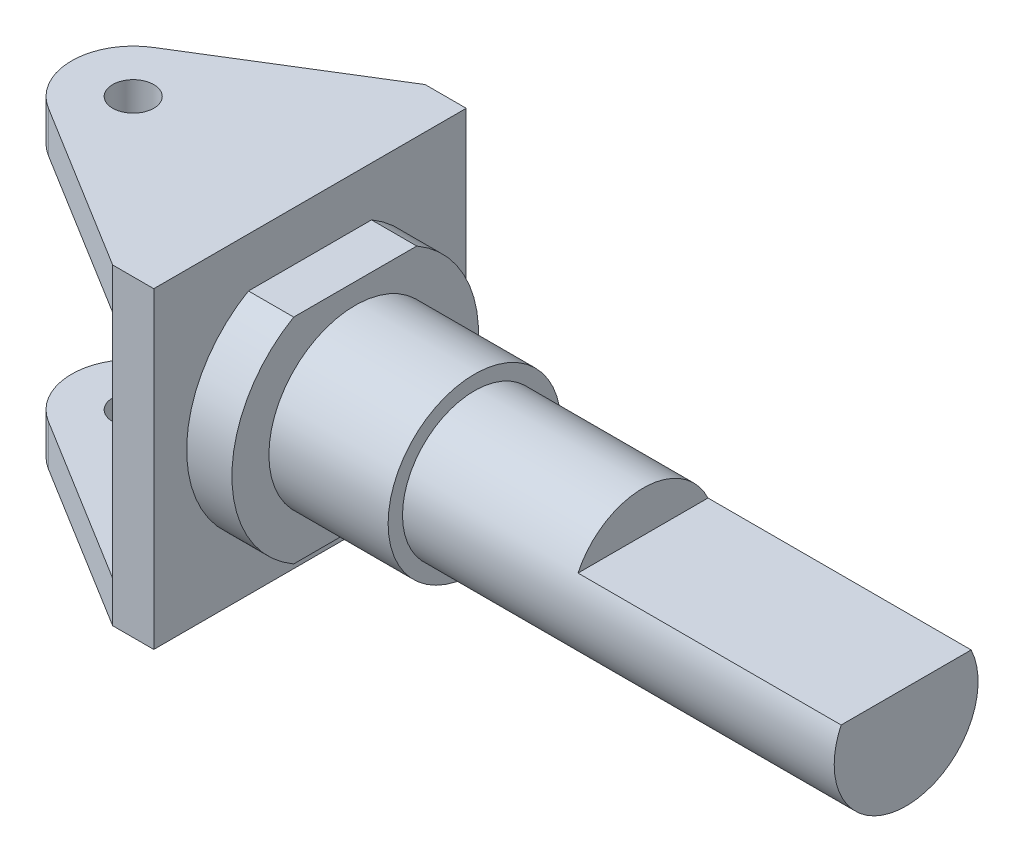
ISO-10303-21;
HEADER;
FILE_DESCRIPTION(('STEP AP214'),'2;1');
FILE_NAME('part.step','',(''),(''),'','','');
FILE_SCHEMA(('AUTOMOTIVE_DESIGN { 1 0 10303 214 1 1 1 1 }'));
ENDSEC;
DATA;
#1=APPLICATION_CONTEXT('core data for automotive mechanical design processes');
#2=APPLICATION_PROTOCOL_DEFINITION('international standard','automotive_design',2000,#1);
#3=PRODUCT_CONTEXT('',#1,'mechanical');
#4=PRODUCT('Part','Part','',(#3));
#5=PRODUCT_RELATED_PRODUCT_CATEGORY('part','',(#4));
#6=PRODUCT_DEFINITION_FORMATION('','',#4);
#7=PRODUCT_DEFINITION_CONTEXT('part definition',#1,'design');
#8=PRODUCT_DEFINITION('design','',#6,#7);
#9=PRODUCT_DEFINITION_SHAPE('','',#8);
#10=(LENGTH_UNIT() NAMED_UNIT(*) SI_UNIT(.MILLI.,.METRE.));
#11=(NAMED_UNIT(*) PLANE_ANGLE_UNIT() SI_UNIT($,.RADIAN.));
#12=(NAMED_UNIT(*) SI_UNIT($,.STERADIAN.) SOLID_ANGLE_UNIT());
#13=UNCERTAINTY_MEASURE_WITH_UNIT(LENGTH_MEASURE(1.E-05),#10,'distance_accuracy_value','');
#14=(GEOMETRIC_REPRESENTATION_CONTEXT(3) GLOBAL_UNCERTAINTY_ASSIGNED_CONTEXT((#13)) GLOBAL_UNIT_ASSIGNED_CONTEXT((#10,
#11,#12)) REPRESENTATION_CONTEXT('',''));
#15=CARTESIAN_POINT('',(0.,0.,0.));
#16=DIRECTION('',(0.,0.,1.));
#17=DIRECTION('',(1.,0.,0.));
#18=AXIS2_PLACEMENT_3D('',#15,#16,#17);
#19=CARTESIAN_POINT('',(-26.6804738151481,0.,0.));
#20=DIRECTION('',(-1.,0.,0.));
#21=DIRECTION('',(0.,0.,1.));
#22=AXIS2_PLACEMENT_3D('',#19,#20,#21);
#23=PLANE('',#22);
#24=DIRECTION('',(0.,-1.,0.));
#25=VECTOR('',#24,1.);
#26=CARTESIAN_POINT('',(-26.6804738151481,38.,-38.));
#27=LINE('',#26,#25);
#28=CARTESIAN_POINT('',(-26.6804738151481,28.,-38.));
#29=VERTEX_POINT('',#28);
#30=CARTESIAN_POINT('',(-26.6804738151481,-28.,-38.));
#31=VERTEX_POINT('',#30);
#32=EDGE_CURVE('E254',#29,#31,#27,.T.);
#33=ORIENTED_EDGE('',*,*,#32,.T.);
#34=DIRECTION('',(0.,0.,1.));
#35=VECTOR('',#34,1.);
#36=CARTESIAN_POINT('',(-26.6804738151481,-28.,0.));
#37=LINE('',#36,#35);
#38=CARTESIAN_POINT('',(-26.6804738151481,-28.,38.));
#39=VERTEX_POINT('',#38);
#40=EDGE_CURVE('E55',#31,#39,#37,.T.);
#41=ORIENTED_EDGE('',*,*,#40,.T.);
#42=DIRECTION('',(0.,1.,0.));
#43=VECTOR('',#42,1.);
#44=CARTESIAN_POINT('',(-26.6804738151481,38.,38.));
#45=LINE('',#44,#43);
#46=CARTESIAN_POINT('',(-26.6804738151481,28.,38.));
#47=VERTEX_POINT('',#46);
#48=EDGE_CURVE('E255',#39,#47,#45,.T.);
#49=ORIENTED_EDGE('',*,*,#48,.T.);
#50=DIRECTION('',(0.,0.,1.));
#51=VECTOR('',#50,1.);
#52=CARTESIAN_POINT('',(-26.6804738151481,28.,0.));
#53=LINE('',#52,#51);
#54=EDGE_CURVE('E217',#29,#47,#53,.T.);
#55=ORIENTED_EDGE('',*,*,#54,.F.);
#56=EDGE_LOOP('',(#33,#41,#49,#55));
#57=FACE_BOUND('',#56,.T.);
#58=ADVANCED_FACE('F39',(#57),#23,.T.);
#59=CARTESIAN_POINT('',(-16.6804738151481,0.,0.));
#60=DIRECTION('',(-1.,0.,0.));
#61=DIRECTION('',(0.,0.,1.));
#62=AXIS2_PLACEMENT_3D('',#59,#60,#61);
#63=CYLINDRICAL_SURFACE('',#62,30.);
#64=CARTESIAN_POINT('',(-5.68047381514815,0.,0.));
#65=DIRECTION('',(-1.,0.,0.));
#66=DIRECTION('',(0.,0.,1.));
#67=AXIS2_PLACEMENT_3D('',#64,#65,#66);
#68=CIRCLE('',#67,30.);
#69=CARTESIAN_POINT('',(-5.68047381514815,-26.,14.9666295470958));
#70=VERTEX_POINT('',#69);
#71=CARTESIAN_POINT('',(-5.68047381514815,26.,14.9666295470958));
#72=VERTEX_POINT('',#71);
#73=EDGE_CURVE('E340',#70,#72,#68,.T.);
#74=ORIENTED_EDGE('',*,*,#73,.T.);
#75=DIRECTION('',(-1.,0.,0.));
#76=VECTOR('',#75,1.);
#77=CARTESIAN_POINT('',(-16.6804738151481,26.,14.9666295470958));
#78=LINE('',#77,#76);
#79=CARTESIAN_POINT('',(-16.6804738151481,26.,14.9666295470958));
#80=VERTEX_POINT('',#79);
#81=EDGE_CURVE('E308',#72,#80,#78,.T.);
#82=ORIENTED_EDGE('',*,*,#81,.T.);
#83=CARTESIAN_POINT('',(-16.6804738151481,0.,0.));
#84=DIRECTION('',(-1.,0.,0.));
#85=DIRECTION('',(0.,0.,1.));
#86=AXIS2_PLACEMENT_3D('',#83,#84,#85);
#87=CIRCLE('',#86,30.);
#88=CARTESIAN_POINT('',(-16.6804738151481,-26.,14.9666295470958));
#89=VERTEX_POINT('',#88);
#90=EDGE_CURVE('E345',#89,#80,#87,.T.);
#91=ORIENTED_EDGE('',*,*,#90,.F.);
#92=DIRECTION('',(-1.,0.,0.));
#93=VECTOR('',#92,1.);
#94=CARTESIAN_POINT('',(-16.6804738151481,-26.,14.9666295470958));
#95=LINE('',#94,#93);
#96=EDGE_CURVE('E288',#89,#70,#95,.F.);
#97=ORIENTED_EDGE('',*,*,#96,.T.);
#98=EDGE_LOOP('',(#74,#82,#91,#97));
#99=FACE_BOUND('',#98,.T.);
#100=ADVANCED_FACE('F421',(#99),#63,.T.);
#101=CARTESIAN_POINT('',(-16.6804738151481,26.,-14.9666295470958));
#102=VERTEX_POINT('',#101);
#103=CARTESIAN_POINT('',(-16.6804738151481,-26.,-14.9666295470958));
#104=VERTEX_POINT('',#103);
#105=EDGE_CURVE('E349',#102,#104,#87,.T.);
#106=ORIENTED_EDGE('',*,*,#105,.F.);
#107=DIRECTION('',(-1.,0.,0.));
#108=VECTOR('',#107,1.);
#109=CARTESIAN_POINT('',(-16.6804738151481,26.,-14.9666295470958));
#110=LINE('',#109,#108);
#111=CARTESIAN_POINT('',(-5.68047381514815,26.,-14.9666295470958));
#112=VERTEX_POINT('',#111);
#113=EDGE_CURVE('E300',#102,#112,#110,.F.);
#114=ORIENTED_EDGE('',*,*,#113,.T.);
#115=CARTESIAN_POINT('',(-5.68047381514815,-26.,-14.9666295470958));
#116=VERTEX_POINT('',#115);
#117=EDGE_CURVE('E344',#112,#116,#68,.T.);
#118=ORIENTED_EDGE('',*,*,#117,.T.);
#119=DIRECTION('',(-1.,0.,0.));
#120=VECTOR('',#119,1.);
#121=CARTESIAN_POINT('',(-16.6804738151481,-26.,-14.9666295470958));
#122=LINE('',#121,#120);
#123=EDGE_CURVE('E296',#116,#104,#122,.T.);
#124=ORIENTED_EDGE('',*,*,#123,.T.);
#125=EDGE_LOOP('',(#106,#114,#118,#124));
#126=FACE_BOUND('',#125,.T.);
#127=ADVANCED_FACE('F41',(#126),#63,.T.);
#128=CARTESIAN_POINT('',(-5.68047381514815,30.,0.));
#129=DIRECTION('',(-1.,0.,0.));
#130=DIRECTION('',(0.,0.,1.));
#131=AXIS2_PLACEMENT_3D('',#128,#129,#130);
#132=PLANE('',#131);
#133=ORIENTED_EDGE('',*,*,#117,.F.);
#134=DIRECTION('',(0.,0.,1.));
#135=VECTOR('',#134,1.);
#136=CARTESIAN_POINT('',(-5.68047381514815,26.,0.));
#137=LINE('',#136,#135);
#138=EDGE_CURVE('E11',#112,#72,#137,.T.);
#139=ORIENTED_EDGE('',*,*,#138,.T.);
#140=ORIENTED_EDGE('',*,*,#73,.F.);
#141=DIRECTION('',(0.,0.,-1.));
#142=VECTOR('',#141,1.);
#143=CARTESIAN_POINT('',(-5.68047381514815,-26.,0.));
#144=LINE('',#143,#142);
#145=EDGE_CURVE('E48',#70,#116,#144,.T.);
#146=ORIENTED_EDGE('',*,*,#145,.T.);
#147=EDGE_LOOP('',(#133,#139,#140,#146));
#148=FACE_BOUND('',#147,.T.);
#149=CARTESIAN_POINT('',(-5.68047381514815,0.,0.));
#150=DIRECTION('',(-1.,0.,0.));
#151=DIRECTION('',(0.,0.,1.));
#152=AXIS2_PLACEMENT_3D('',#149,#150,#151);
#153=CIRCLE('',#152,21.);
#154=CARTESIAN_POINT('',(-5.68047381514815,0.,21.));
#155=VERTEX_POINT('',#154);
#156=EDGE_CURVE('E336',#155,#155,#153,.T.);
#157=ORIENTED_EDGE('',*,*,#156,.T.);
#158=EDGE_LOOP('',(#157));
#159=FACE_BOUND('',#158,.T.);
#160=ADVANCED_FACE('F362',(#148,#159),#132,.F.);
#161=CARTESIAN_POINT('',(-16.6804738151481,0.,0.));
#162=DIRECTION('',(-1.,0.,0.));
#163=DIRECTION('',(0.,0.,1.));
#164=AXIS2_PLACEMENT_3D('',#161,#162,#163);
#165=CYLINDRICAL_SURFACE('',#164,21.);
#166=ORIENTED_EDGE('',*,*,#156,.F.);
#167=EDGE_LOOP('',(#166));
#168=FACE_BOUND('',#167,.T.);
#169=CARTESIAN_POINT('',(23.3195261848518,0.,0.));
#170=DIRECTION('',(-1.,0.,0.));
#171=DIRECTION('',(0.,0.,1.));
#172=AXIS2_PLACEMENT_3D('',#169,#170,#171);
#173=CIRCLE('',#172,21.);
#174=CARTESIAN_POINT('',(23.3195261848518,0.,21.));
#175=VERTEX_POINT('',#174);
#176=EDGE_CURVE('E332',#175,#175,#173,.T.);
#177=ORIENTED_EDGE('',*,*,#176,.T.);
#178=EDGE_LOOP('',(#177));
#179=FACE_BOUND('',#178,.T.);
#180=ADVANCED_FACE('F468',(#168,#179),#165,.T.);
#181=CARTESIAN_POINT('',(23.3195261848518,21.,0.));
#182=DIRECTION('',(-1.,0.,0.));
#183=DIRECTION('',(0.,0.,1.));
#184=AXIS2_PLACEMENT_3D('',#181,#182,#183);
#185=PLANE('',#184);
#186=ORIENTED_EDGE('',*,*,#176,.F.);
#187=EDGE_LOOP('',(#186));
#188=FACE_BOUND('',#187,.T.);
#189=CARTESIAN_POINT('',(23.3195261848518,0.,0.));
#190=DIRECTION('',(-1.,0.,0.));
#191=DIRECTION('',(0.,0.,1.));
#192=AXIS2_PLACEMENT_3D('',#189,#190,#191);
#193=CIRCLE('',#192,17.5);
#194=CARTESIAN_POINT('',(23.3195261848518,0.,17.5));
#195=VERTEX_POINT('',#194);
#196=EDGE_CURVE('E328',#195,#195,#193,.T.);
#197=ORIENTED_EDGE('',*,*,#196,.T.);
#198=EDGE_LOOP('',(#197));
#199=FACE_BOUND('',#198,.T.);
#200=ADVANCED_FACE('F464',(#188,#199),#185,.F.);
#201=CARTESIAN_POINT('',(-16.6804738151481,0.,0.));
#202=DIRECTION('',(-1.,0.,0.));
#203=DIRECTION('',(0.,0.,1.));
#204=AXIS2_PLACEMENT_3D('',#201,#202,#203);
#205=CYLINDRICAL_SURFACE('',#204,17.5);
#206=CARTESIAN_POINT('',(128.319526184852,0.,0.));
#207=DIRECTION('',(-1.,0.,0.));
#208=DIRECTION('',(0.,0.,1.));
#209=AXIS2_PLACEMENT_3D('',#206,#207,#208);
#210=CIRCLE('',#209,17.5);
#211=CARTESIAN_POINT('',(128.319526184852,7.5,-15.8113883008419));
#212=VERTEX_POINT('',#211);
#213=CARTESIAN_POINT('',(128.319526184852,7.5,15.8113883008419));
#214=VERTEX_POINT('',#213);
#215=EDGE_CURVE('E324',#212,#214,#210,.T.);
#216=ORIENTED_EDGE('',*,*,#215,.T.);
#217=DIRECTION('',(-1.,0.,0.));
#218=VECTOR('',#217,1.);
#219=CARTESIAN_POINT('',(-16.6804738151481,7.5,15.8113883008419));
#220=LINE('',#219,#218);
#221=CARTESIAN_POINT('',(64.3195261848518,7.5,15.8113883008419));
#222=VERTEX_POINT('',#221);
#223=EDGE_CURVE('E320',#214,#222,#220,.T.);
#224=ORIENTED_EDGE('',*,*,#223,.T.);
#225=CARTESIAN_POINT('',(64.3195261848518,0.,0.));
#226=DIRECTION('',(1.,0.,0.));
#227=DIRECTION('',(0.,0.,-1.));
#228=AXIS2_PLACEMENT_3D('',#225,#226,#227);
#229=CIRCLE('',#228,17.5);
#230=CARTESIAN_POINT('',(64.3195261848518,7.5,-15.8113883008419));
#231=VERTEX_POINT('',#230);
#232=EDGE_CURVE('E354',#231,#222,#229,.T.);
#233=ORIENTED_EDGE('',*,*,#232,.F.);
#234=DIRECTION('',(-1.,0.,0.));
#235=VECTOR('',#234,1.);
#236=CARTESIAN_POINT('',(-16.6804738151481,7.5,-15.8113883008419));
#237=LINE('',#236,#235);
#238=EDGE_CURVE('E316',#231,#212,#237,.F.);
#239=ORIENTED_EDGE('',*,*,#238,.T.);
#240=EDGE_LOOP('',(#216,#224,#233,#239));
#241=FACE_BOUND('',#240,.T.);
#242=ORIENTED_EDGE('',*,*,#196,.F.);
#243=EDGE_LOOP('',(#242));
#244=FACE_BOUND('',#243,.T.);
#245=ADVANCED_FACE('F460',(#241,#244),#205,.T.);
#246=CARTESIAN_POINT('',(128.319526184852,17.5,0.));
#247=DIRECTION('',(-1.,0.,0.));
#248=DIRECTION('',(0.,0.,1.));
#249=AXIS2_PLACEMENT_3D('',#246,#247,#248);
#250=PLANE('',#249);
#251=ORIENTED_EDGE('',*,*,#215,.F.);
#252=DIRECTION('',(0.,0.,1.));
#253=VECTOR('',#252,1.);
#254=CARTESIAN_POINT('',(128.319526184852,7.5,0.));
#255=LINE('',#254,#253);
#256=EDGE_CURVE('E350',#212,#214,#255,.T.);
#257=ORIENTED_EDGE('',*,*,#256,.T.);
#258=EDGE_LOOP('',(#251,#257));
#259=FACE_BOUND('',#258,.T.);
#260=ADVANCED_FACE('F453',(#259),#250,.F.);
#261=CARTESIAN_POINT('',(64.3195261848518,0.,0.));
#262=DIRECTION('',(1.,0.,0.));
#263=DIRECTION('',(0.,0.,-1.));
#264=AXIS2_PLACEMENT_3D('',#261,#262,#263);
#265=PLANE('',#264);
#266=ORIENTED_EDGE('',*,*,#232,.T.);
#267=DIRECTION('',(0.,0.,-1.));
#268=VECTOR('',#267,1.);
#269=CARTESIAN_POINT('',(64.3195261848518,7.5,18.6741340221226));
#270=LINE('',#269,#268);
#271=EDGE_CURVE('E312',#222,#231,#270,.T.);
#272=ORIENTED_EDGE('',*,*,#271,.T.);
#273=EDGE_LOOP('',(#266,#272));
#274=FACE_BOUND('',#273,.T.);
#275=ADVANCED_FACE('F450',(#274),#265,.T.);
#276=CARTESIAN_POINT('',(64.3195261848518,7.5,18.6741340221226));
#277=DIRECTION('',(0.,-1.,0.));
#278=DIRECTION('',(0.,0.,-1.));
#279=AXIS2_PLACEMENT_3D('',#276,#277,#278);
#280=PLANE('',#279);
#281=ORIENTED_EDGE('',*,*,#256,.F.);
#282=ORIENTED_EDGE('',*,*,#238,.F.);
#283=ORIENTED_EDGE('',*,*,#271,.F.);
#284=ORIENTED_EDGE('',*,*,#223,.F.);
#285=EDGE_LOOP('',(#281,#282,#283,#284));
#286=FACE_BOUND('',#285,.T.);
#287=ADVANCED_FACE('F449',(#286),#280,.F.);
#288=CARTESIAN_POINT('',(-69.6804738151481,-26.,25.4821979962334));
#289=DIRECTION('',(0.,1.,0.));
#290=DIRECTION('',(0.,0.,1.));
#291=AXIS2_PLACEMENT_3D('',#288,#289,#290);
#292=PLANE('',#291);
#293=ORIENTED_EDGE('',*,*,#145,.F.);
#294=ORIENTED_EDGE('',*,*,#96,.F.);
#295=DIRECTION('',(0.,0.,1.));
#296=VECTOR('',#295,1.);
#297=CARTESIAN_POINT('',(-16.6804738151481,-26.,0.));
#298=LINE('',#297,#296);
#299=EDGE_CURVE('E292',#104,#89,#298,.T.);
#300=ORIENTED_EDGE('',*,*,#299,.F.);
#301=ORIENTED_EDGE('',*,*,#123,.F.);
#302=EDGE_LOOP('',(#293,#294,#300,#301));
#303=FACE_BOUND('',#302,.T.);
#304=ADVANCED_FACE('F445',(#303),#292,.F.);
#305=CARTESIAN_POINT('',(-69.6804738151481,26.,29.1704108641092));
#306=DIRECTION('',(0.,-1.,0.));
#307=DIRECTION('',(0.,0.,-1.));
#308=AXIS2_PLACEMENT_3D('',#305,#306,#307);
#309=PLANE('',#308);
#310=ORIENTED_EDGE('',*,*,#138,.F.);
#311=ORIENTED_EDGE('',*,*,#113,.F.);
#312=DIRECTION('',(0.,0.,-1.));
#313=VECTOR('',#312,1.);
#314=CARTESIAN_POINT('',(-16.6804738151481,26.,0.));
#315=LINE('',#314,#313);
#316=EDGE_CURVE('E304',#80,#102,#315,.T.);
#317=ORIENTED_EDGE('',*,*,#316,.F.);
#318=ORIENTED_EDGE('',*,*,#81,.F.);
#319=EDGE_LOOP('',(#310,#311,#317,#318));
#320=FACE_BOUND('',#319,.T.);
#321=ADVANCED_FACE('F433',(#320),#309,.F.);
#322=CARTESIAN_POINT('',(-16.6804738151481,0.,0.));
#323=DIRECTION('',(-1.,0.,0.));
#324=DIRECTION('',(0.,0.,1.));
#325=AXIS2_PLACEMENT_3D('',#322,#323,#324);
#326=PLANE('',#325);
#327=DIRECTION('',(0.,1.,0.));
#328=VECTOR('',#327,1.);
#329=CARTESIAN_POINT('',(-16.6804738151481,38.,38.));
#330=LINE('',#329,#328);
#331=CARTESIAN_POINT('',(-16.6804738151481,-38.,38.));
#332=VERTEX_POINT('',#331);
#333=CARTESIAN_POINT('',(-16.6804738151481,38.,38.));
#334=VERTEX_POINT('',#333);
#335=EDGE_CURVE('E242',#332,#334,#330,.T.);
#336=ORIENTED_EDGE('',*,*,#335,.F.);
#337=DIRECTION('',(0.,0.,1.));
#338=VECTOR('',#337,1.);
#339=CARTESIAN_POINT('',(-16.6804738151481,-38.,-38.));
#340=LINE('',#339,#338);
#341=CARTESIAN_POINT('',(-16.6804738151481,-38.,-38.));
#342=VERTEX_POINT('',#341);
#343=EDGE_CURVE('E270',#342,#332,#340,.T.);
#344=ORIENTED_EDGE('',*,*,#343,.F.);
#345=DIRECTION('',(0.,-1.,0.));
#346=VECTOR('',#345,1.);
#347=CARTESIAN_POINT('',(-16.6804738151481,38.,-38.));
#348=LINE('',#347,#346);
#349=CARTESIAN_POINT('',(-16.6804738151481,38.,-38.));
#350=VERTEX_POINT('',#349);
#351=EDGE_CURVE('E267',#350,#342,#348,.T.);
#352=ORIENTED_EDGE('',*,*,#351,.F.);
#353=DIRECTION('',(0.,0.,-1.));
#354=VECTOR('',#353,1.);
#355=CARTESIAN_POINT('',(-16.6804738151481,38.,-38.));
#356=LINE('',#355,#354);
#357=EDGE_CURVE('E264',#334,#350,#356,.T.);
#358=ORIENTED_EDGE('',*,*,#357,.F.);
#359=EDGE_LOOP('',(#336,#344,#352,#358));
#360=FACE_BOUND('',#359,.T.);
#361=ORIENTED_EDGE('',*,*,#299,.T.);
#362=ORIENTED_EDGE('',*,*,#90,.T.);
#363=ORIENTED_EDGE('',*,*,#316,.T.);
#364=ORIENTED_EDGE('',*,*,#105,.T.);
#365=EDGE_LOOP('',(#361,#362,#363,#364));
#366=FACE_BOUND('',#365,.T.);
#367=ADVANCED_FACE('F399',(#360,#366),#326,.F.);
#368=CARTESIAN_POINT('',(-26.6804738151481,38.,38.));
#369=DIRECTION('',(0.,0.,-1.));
#370=DIRECTION('',(0.,1.,0.));
#371=AXIS2_PLACEMENT_3D('',#368,#369,#370);
#372=PLANE('',#371);
#373=ORIENTED_EDGE('',*,*,#335,.T.);
#374=DIRECTION('',(1.,0.,0.));
#375=VECTOR('',#374,1.);
#376=CARTESIAN_POINT('',(-26.6804738151481,38.,38.));
#377=LINE('',#376,#375);
#378=CARTESIAN_POINT('',(-26.6804738151481,38.,38.));
#379=VERTEX_POINT('',#378);
#380=EDGE_CURVE('E284',#379,#334,#377,.T.);
#381=ORIENTED_EDGE('',*,*,#380,.F.);
#382=DIRECTION('',(0.,1.,0.));
#383=VECTOR('',#382,1.);
#384=CARTESIAN_POINT('',(-26.6804738151481,28.,38.));
#385=LINE('',#384,#383);
#386=EDGE_CURVE('E243',#47,#379,#385,.T.);
#387=ORIENTED_EDGE('',*,*,#386,.F.);
#388=ORIENTED_EDGE('',*,*,#48,.F.);
#389=CARTESIAN_POINT('',(-26.6804738151481,-38.,38.));
#390=VERTEX_POINT('',#389);
#391=EDGE_CURVE('E250',#390,#39,#45,.T.);
#392=ORIENTED_EDGE('',*,*,#391,.F.);
#393=DIRECTION('',(1.,0.,0.));
#394=VECTOR('',#393,1.);
#395=CARTESIAN_POINT('',(-26.6804738151481,-38.,38.));
#396=LINE('',#395,#394);
#397=EDGE_CURVE('E260',#390,#332,#396,.T.);
#398=ORIENTED_EDGE('',*,*,#397,.T.);
#399=EDGE_LOOP('',(#373,#381,#387,#388,#392,#398));
#400=FACE_BOUND('',#399,.T.);
#401=ADVANCED_FACE('F375',(#400),#372,.F.);
#402=CARTESIAN_POINT('',(-26.6804738151481,38.,-38.));
#403=DIRECTION('',(0.,-1.,0.));
#404=DIRECTION('',(0.,0.,-1.));
#405=AXIS2_PLACEMENT_3D('',#402,#403,#404);
#406=PLANE('',#405);
#407=ORIENTED_EDGE('',*,*,#357,.T.);
#408=DIRECTION('',(1.,0.,0.));
#409=VECTOR('',#408,1.);
#410=CARTESIAN_POINT('',(-26.6804738151481,38.,-38.));
#411=LINE('',#410,#409);
#412=CARTESIAN_POINT('',(-26.6804738151481,38.,-38.));
#413=VERTEX_POINT('',#412);
#414=EDGE_CURVE('E280',#413,#350,#411,.T.);
#415=ORIENTED_EDGE('',*,*,#414,.F.);
#416=DIRECTION('',(-0.850917648531105,0.,0.525299110429757));
#417=VECTOR('',#416,1.);
#418=CARTESIAN_POINT('',(-24.347666195962,38.,-39.440117935358));
#419=LINE('',#418,#417);
#420=CARTESIAN_POINT('',(-67.5599604715945,38.,-12.7637647279666));
#421=VERTEX_POINT('',#420);
#422=EDGE_CURVE('E211',#413,#421,#419,.T.);
#423=ORIENTED_EDGE('',*,*,#422,.T.);
#424=CARTESIAN_POINT('',(-59.6804738151481,38.,0.));
#425=DIRECTION('',(0.,1.,0.));
#426=DIRECTION('',(0.,0.,1.));
#427=AXIS2_PLACEMENT_3D('',#424,#425,#426);
#428=CIRCLE('',#427,15.);
#429=CARTESIAN_POINT('',(-67.5599604715945,38.,12.7637647279666));
#430=VERTEX_POINT('',#429);
#431=EDGE_CURVE('E229',#430,#421,#428,.F.);
#432=ORIENTED_EDGE('',*,*,#431,.F.);
#433=DIRECTION('',(-0.850917648531105,0.,-0.525299110429758));
#434=VECTOR('',#433,1.);
#435=CARTESIAN_POINT('',(-24.347666195962,38.,39.4401179353579));
#436=LINE('',#435,#434);
#437=EDGE_CURVE('E233',#379,#430,#436,.T.);
#438=ORIENTED_EDGE('',*,*,#437,.F.);
#439=ORIENTED_EDGE('',*,*,#380,.T.);
#440=EDGE_LOOP('',(#407,#415,#423,#432,#438,#439));
#441=FACE_BOUND('',#440,.T.);
#442=CARTESIAN_POINT('',(-59.6804738151481,38.,0.));
#443=DIRECTION('',(0.,1.,0.));
#444=DIRECTION('',(0.,0.,1.));
#445=AXIS2_PLACEMENT_3D('',#442,#443,#444);
#446=CIRCLE('',#445,5.);
#447=CARTESIAN_POINT('',(-59.6804738151481,38.,5.));
#448=VERTEX_POINT('',#447);
#449=EDGE_CURVE('E203',#448,#448,#446,.T.);
#450=ORIENTED_EDGE('',*,*,#449,.F.);
#451=EDGE_LOOP('',(#450));
#452=FACE_BOUND('',#451,.T.);
#453=ADVANCED_FACE('F438',(#441,#452),#406,.F.);
#454=CARTESIAN_POINT('',(-26.6804738151481,38.,-38.));
#455=DIRECTION('',(0.,0.,1.));
#456=DIRECTION('',(0.,-1.,0.));
#457=AXIS2_PLACEMENT_3D('',#454,#455,#456);
#458=PLANE('',#457);
#459=ORIENTED_EDGE('',*,*,#351,.T.);
#460=DIRECTION('',(1.,0.,0.));
#461=VECTOR('',#460,1.);
#462=CARTESIAN_POINT('',(-26.6804738151481,-38.,-38.));
#463=LINE('',#462,#461);
#464=CARTESIAN_POINT('',(-26.6804738151481,-38.,-38.));
#465=VERTEX_POINT('',#464);
#466=EDGE_CURVE('E276',#465,#342,#463,.T.);
#467=ORIENTED_EDGE('',*,*,#466,.F.);
#468=DIRECTION('',(0.,-1.,0.));
#469=VECTOR('',#468,1.);
#470=CARTESIAN_POINT('',(-26.6804738151481,-28.,-38.));
#471=LINE('',#470,#469);
#472=EDGE_CURVE('E63',#31,#465,#471,.T.);
#473=ORIENTED_EDGE('',*,*,#472,.F.);
#474=ORIENTED_EDGE('',*,*,#32,.F.);
#475=EDGE_CURVE('E256',#413,#29,#27,.T.);
#476=ORIENTED_EDGE('',*,*,#475,.F.);
#477=ORIENTED_EDGE('',*,*,#414,.T.);
#478=EDGE_LOOP('',(#459,#467,#473,#474,#476,#477));
#479=FACE_BOUND('',#478,.T.);
#480=ADVANCED_FACE('F393',(#479),#458,.F.);
#481=CARTESIAN_POINT('',(-26.6804738151481,-38.,-38.));
#482=DIRECTION('',(0.,1.,0.));
#483=DIRECTION('',(0.,0.,1.));
#484=AXIS2_PLACEMENT_3D('',#481,#482,#483);
#485=PLANE('',#484);
#486=ORIENTED_EDGE('',*,*,#343,.T.);
#487=ORIENTED_EDGE('',*,*,#397,.F.);
#488=DIRECTION('',(-0.850917648531105,0.,-0.525299110429758));
#489=VECTOR('',#488,1.);
#490=CARTESIAN_POINT('',(-24.347666195962,-38.,39.4401179353579));
#491=LINE('',#490,#489);
#492=CARTESIAN_POINT('',(-67.5599604715945,-38.,12.7637647279666));
#493=VERTEX_POINT('',#492);
#494=EDGE_CURVE('E182',#390,#493,#491,.T.);
#495=ORIENTED_EDGE('',*,*,#494,.T.);
#496=CARTESIAN_POINT('',(-59.6804738151481,-38.,0.));
#497=DIRECTION('',(0.,1.,0.));
#498=DIRECTION('',(0.,0.,1.));
#499=AXIS2_PLACEMENT_3D('',#496,#497,#498);
#500=CIRCLE('',#499,15.);
#501=CARTESIAN_POINT('',(-67.5599604715945,-38.,-12.7637647279666));
#502=VERTEX_POINT('',#501);
#503=EDGE_CURVE('E193',#493,#502,#500,.F.);
#504=ORIENTED_EDGE('',*,*,#503,.T.);
#505=DIRECTION('',(-0.850917648531105,0.,0.525299110429757));
#506=VECTOR('',#505,1.);
#507=CARTESIAN_POINT('',(-24.347666195962,-38.,-39.440117935358));
#508=LINE('',#507,#506);
#509=EDGE_CURVE('E168',#465,#502,#508,.T.);
#510=ORIENTED_EDGE('',*,*,#509,.F.);
#511=ORIENTED_EDGE('',*,*,#466,.T.);
#512=EDGE_LOOP('',(#486,#487,#495,#504,#510,#511));
#513=FACE_BOUND('',#512,.T.);
#514=CARTESIAN_POINT('',(-59.6804738151481,-38.,0.));
#515=DIRECTION('',(0.,1.,0.));
#516=DIRECTION('',(0.,0.,1.));
#517=AXIS2_PLACEMENT_3D('',#514,#515,#516);
#518=CIRCLE('',#517,5.);
#519=CARTESIAN_POINT('',(-59.6804738151481,-38.,5.));
#520=VERTEX_POINT('',#519);
#521=EDGE_CURVE('E189',#520,#520,#518,.T.);
#522=ORIENTED_EDGE('',*,*,#521,.T.);
#523=EDGE_LOOP('',(#522));
#524=FACE_BOUND('',#523,.T.);
#525=ADVANCED_FACE('F403',(#513,#524),#485,.F.);
#526=CARTESIAN_POINT('',(-59.6804738151481,28.,0.));
#527=DIRECTION('',(0.,1.,0.));
#528=DIRECTION('',(0.,0.,1.));
#529=AXIS2_PLACEMENT_3D('',#526,#527,#528);
#530=CYLINDRICAL_SURFACE('',#529,15.);
#531=ORIENTED_EDGE('',*,*,#431,.T.);
#532=DIRECTION('',(0.,1.,0.));
#533=VECTOR('',#532,1.);
#534=CARTESIAN_POINT('',(-67.5599604715945,28.,-12.7637647279666));
#535=LINE('',#534,#533);
#536=CARTESIAN_POINT('',(-67.5599604715945,28.,-12.7637647279666));
#537=VERTEX_POINT('',#536);
#538=EDGE_CURVE('E239',#537,#421,#535,.T.);
#539=ORIENTED_EDGE('',*,*,#538,.F.);
#540=CARTESIAN_POINT('',(-59.6804738151481,28.,0.));
#541=DIRECTION('',(0.,1.,0.));
#542=DIRECTION('',(0.,0.,1.));
#543=AXIS2_PLACEMENT_3D('',#540,#541,#542);
#544=CIRCLE('',#543,15.);
#545=CARTESIAN_POINT('',(-67.5599604715945,28.,12.7637647279666));
#546=VERTEX_POINT('',#545);
#547=EDGE_CURVE('E210',#546,#537,#544,.F.);
#548=ORIENTED_EDGE('',*,*,#547,.F.);
#549=DIRECTION('',(0.,1.,0.));
#550=VECTOR('',#549,1.);
#551=CARTESIAN_POINT('',(-67.5599604715945,28.,12.7637647279666));
#552=LINE('',#551,#550);
#553=EDGE_CURVE('E225',#546,#430,#552,.T.);
#554=ORIENTED_EDGE('',*,*,#553,.T.);
#555=EDGE_LOOP('',(#531,#539,#548,#554));
#556=FACE_BOUND('',#555,.T.);
#557=ADVANCED_FACE('F388',(#556),#530,.T.);
#558=CARTESIAN_POINT('',(-24.347666195962,28.,-39.440117935358));
#559=DIRECTION('',(-0.525299110429757,0.,-0.850917648531105));
#560=DIRECTION('',(-0.850917648531105,0.,0.525299110429757));
#561=AXIS2_PLACEMENT_3D('',#558,#559,#560);
#562=PLANE('',#561);
#563=ORIENTED_EDGE('',*,*,#422,.F.);
#564=ORIENTED_EDGE('',*,*,#475,.T.);
#565=DIRECTION('',(-0.850917648531105,0.,0.525299110429757));
#566=VECTOR('',#565,1.);
#567=CARTESIAN_POINT('',(-24.347666195962,28.,-39.440117935358));
#568=LINE('',#567,#566);
#569=EDGE_CURVE('E221',#29,#537,#568,.T.);
#570=ORIENTED_EDGE('',*,*,#569,.T.);
#571=ORIENTED_EDGE('',*,*,#538,.T.);
#572=EDGE_LOOP('',(#563,#564,#570,#571));
#573=FACE_BOUND('',#572,.T.);
#574=ADVANCED_FACE('F391',(#573),#562,.T.);
#575=CARTESIAN_POINT('',(-59.6804738151481,28.,0.));
#576=DIRECTION('',(0.,1.,0.));
#577=DIRECTION('',(0.,0.,1.));
#578=AXIS2_PLACEMENT_3D('',#575,#576,#577);
#579=CYLINDRICAL_SURFACE('',#578,5.);
#580=CARTESIAN_POINT('',(-59.6804738151481,28.,0.));
#581=DIRECTION('',(0.,1.,0.));
#582=DIRECTION('',(0.,0.,1.));
#583=AXIS2_PLACEMENT_3D('',#580,#581,#582);
#584=CIRCLE('',#583,5.);
#585=CARTESIAN_POINT('',(-59.6804738151481,28.,5.));
#586=VERTEX_POINT('',#585);
#587=EDGE_CURVE('E206',#586,#586,#584,.T.);
#588=ORIENTED_EDGE('',*,*,#587,.F.);
#589=EDGE_LOOP('',(#588));
#590=FACE_BOUND('',#589,.T.);
#591=ORIENTED_EDGE('',*,*,#449,.T.);
#592=EDGE_LOOP('',(#591));
#593=FACE_BOUND('',#592,.T.);
#594=ADVANCED_FACE('F429',(#590,#593),#579,.F.);
#595=CARTESIAN_POINT('',(-24.347666195962,28.,39.4401179353579));
#596=DIRECTION('',(0.525299110429758,0.,-0.850917648531105));
#597=DIRECTION('',(-0.850917648531105,0.,-0.525299110429758));
#598=AXIS2_PLACEMENT_3D('',#595,#596,#597);
#599=PLANE('',#598);
#600=ORIENTED_EDGE('',*,*,#437,.T.);
#601=ORIENTED_EDGE('',*,*,#553,.F.);
#602=DIRECTION('',(-0.850917648531105,0.,-0.525299110429758));
#603=VECTOR('',#602,1.);
#604=CARTESIAN_POINT('',(-24.347666195962,28.,39.4401179353579));
#605=LINE('',#604,#603);
#606=EDGE_CURVE('E214',#47,#546,#605,.T.);
#607=ORIENTED_EDGE('',*,*,#606,.F.);
#608=ORIENTED_EDGE('',*,*,#386,.T.);
#609=EDGE_LOOP('',(#600,#601,#607,#608));
#610=FACE_BOUND('',#609,.T.);
#611=ADVANCED_FACE('F383',(#610),#599,.F.);
#612=CARTESIAN_POINT('',(0.,28.,0.));
#613=DIRECTION('',(0.,1.,0.));
#614=DIRECTION('',(0.,0.,1.));
#615=AXIS2_PLACEMENT_3D('',#612,#613,#614);
#616=PLANE('',#615);
#617=ORIENTED_EDGE('',*,*,#587,.T.);
#618=EDGE_LOOP('',(#617));
#619=FACE_BOUND('',#618,.T.);
#620=ORIENTED_EDGE('',*,*,#547,.T.);
#621=ORIENTED_EDGE('',*,*,#569,.F.);
#622=ORIENTED_EDGE('',*,*,#54,.T.);
#623=ORIENTED_EDGE('',*,*,#606,.T.);
#624=EDGE_LOOP('',(#620,#621,#622,#623));
#625=FACE_BOUND('',#624,.T.);
#626=ADVANCED_FACE('F381',(#619,#625),#616,.F.);
#627=CARTESIAN_POINT('',(-59.6804738151481,-28.,0.));
#628=DIRECTION('',(0.,-1.,0.));
#629=DIRECTION('',(0.,0.,-1.));
#630=AXIS2_PLACEMENT_3D('',#627,#628,#629);
#631=CYLINDRICAL_SURFACE('',#630,15.);
#632=ORIENTED_EDGE('',*,*,#503,.F.);
#633=DIRECTION('',(0.,-1.,0.));
#634=VECTOR('',#633,1.);
#635=CARTESIAN_POINT('',(-67.5599604715945,-28.,12.7637647279666));
#636=LINE('',#635,#634);
#637=CARTESIAN_POINT('',(-67.5599604715945,-28.,12.7637647279666));
#638=VERTEX_POINT('',#637);
#639=EDGE_CURVE('E176',#638,#493,#636,.T.);
#640=ORIENTED_EDGE('',*,*,#639,.F.);
#641=CARTESIAN_POINT('',(-59.6804738151481,-28.,0.));
#642=DIRECTION('',(0.,1.,0.));
#643=DIRECTION('',(0.,0.,1.));
#644=AXIS2_PLACEMENT_3D('',#641,#642,#643);
#645=CIRCLE('',#644,15.);
#646=CARTESIAN_POINT('',(-67.5599604715945,-28.,-12.7637647279666));
#647=VERTEX_POINT('',#646);
#648=EDGE_CURVE('E159',#638,#647,#645,.F.);
#649=ORIENTED_EDGE('',*,*,#648,.T.);
#650=DIRECTION('',(0.,-1.,0.));
#651=VECTOR('',#650,1.);
#652=CARTESIAN_POINT('',(-67.5599604715945,-28.,-12.7637647279666));
#653=LINE('',#652,#651);
#654=EDGE_CURVE('E165',#647,#502,#653,.T.);
#655=ORIENTED_EDGE('',*,*,#654,.T.);
#656=EDGE_LOOP('',(#632,#640,#649,#655));
#657=FACE_BOUND('',#656,.T.);
#658=ADVANCED_FACE('F175',(#657),#631,.T.);
#659=CARTESIAN_POINT('',(-24.347666195962,-28.,39.4401179353579));
#660=DIRECTION('',(-0.525299110429758,0.,0.850917648531105));
#661=DIRECTION('',(0.850917648531105,0.,0.525299110429758));
#662=AXIS2_PLACEMENT_3D('',#659,#660,#661);
#663=PLANE('',#662);
#664=ORIENTED_EDGE('',*,*,#494,.F.);
#665=ORIENTED_EDGE('',*,*,#391,.T.);
#666=DIRECTION('',(-0.850917648531105,0.,-0.525299110429758));
#667=VECTOR('',#666,1.);
#668=CARTESIAN_POINT('',(-24.347666195962,-28.,39.4401179353579));
#669=LINE('',#668,#667);
#670=EDGE_CURVE('E173',#39,#638,#669,.T.);
#671=ORIENTED_EDGE('',*,*,#670,.T.);
#672=ORIENTED_EDGE('',*,*,#639,.T.);
#673=EDGE_LOOP('',(#664,#665,#671,#672));
#674=FACE_BOUND('',#673,.T.);
#675=ADVANCED_FACE('F407',(#674),#663,.T.);
#676=CARTESIAN_POINT('',(-59.6804738151481,-28.,0.));
#677=DIRECTION('',(0.,-1.,0.));
#678=DIRECTION('',(0.,0.,-1.));
#679=AXIS2_PLACEMENT_3D('',#676,#677,#678);
#680=CYLINDRICAL_SURFACE('',#679,5.);
#681=CARTESIAN_POINT('',(-59.6804738151481,-28.,0.));
#682=DIRECTION('',(0.,1.,0.));
#683=DIRECTION('',(0.,0.,1.));
#684=AXIS2_PLACEMENT_3D('',#681,#682,#683);
#685=CIRCLE('',#684,5.);
#686=CARTESIAN_POINT('',(-59.6804738151481,-28.,5.));
#687=VERTEX_POINT('',#686);
#688=EDGE_CURVE('E178',#687,#687,#685,.T.);
#689=ORIENTED_EDGE('',*,*,#688,.T.);
#690=EDGE_LOOP('',(#689));
#691=FACE_BOUND('',#690,.T.);
#692=ORIENTED_EDGE('',*,*,#521,.F.);
#693=EDGE_LOOP('',(#692));
#694=FACE_BOUND('',#693,.T.);
#695=ADVANCED_FACE('F409',(#691,#694),#680,.F.);
#696=CARTESIAN_POINT('',(-24.347666195962,-28.,-39.440117935358));
#697=DIRECTION('',(0.525299110429757,0.,0.850917648531105));
#698=DIRECTION('',(0.850917648531105,0.,-0.525299110429757));
#699=AXIS2_PLACEMENT_3D('',#696,#697,#698);
#700=PLANE('',#699);
#701=ORIENTED_EDGE('',*,*,#509,.T.);
#702=ORIENTED_EDGE('',*,*,#654,.F.);
#703=DIRECTION('',(-0.850917648531105,0.,0.525299110429757));
#704=VECTOR('',#703,1.);
#705=CARTESIAN_POINT('',(-24.347666195962,-28.,-39.440117935358));
#706=LINE('',#705,#704);
#707=EDGE_CURVE('E154',#31,#647,#706,.T.);
#708=ORIENTED_EDGE('',*,*,#707,.F.);
#709=ORIENTED_EDGE('',*,*,#472,.T.);
#710=EDGE_LOOP('',(#701,#702,#708,#709));
#711=FACE_BOUND('',#710,.T.);
#712=ADVANCED_FACE('F166',(#711),#700,.F.);
#713=CARTESIAN_POINT('',(0.,-28.,0.));
#714=DIRECTION('',(0.,-1.,0.));
#715=DIRECTION('',(0.,0.,1.));
#716=AXIS2_PLACEMENT_3D('',#713,#714,#715);
#717=PLANE('',#716);
#718=ORIENTED_EDGE('',*,*,#688,.F.);
#719=EDGE_LOOP('',(#718));
#720=FACE_BOUND('',#719,.T.);
#721=ORIENTED_EDGE('',*,*,#648,.F.);
#722=ORIENTED_EDGE('',*,*,#670,.F.);
#723=ORIENTED_EDGE('',*,*,#40,.F.);
#724=ORIENTED_EDGE('',*,*,#707,.T.);
#725=EDGE_LOOP('',(#721,#722,#723,#724));
#726=FACE_BOUND('',#725,.T.);
#727=ADVANCED_FACE('F156',(#720,#726),#717,.F.);
#728=CLOSED_SHELL('',(#58,#100,#127,#160,#180,#200,#245,#260,#275,#287,#304,#321,#367,#401,#453,
#480,#525,#557,#574,#594,#611,#626,#658,#675,#695,#712,#727));
#729=MANIFOLD_SOLID_BREP('B2',#728);
#730=ADVANCED_BREP_SHAPE_REPRESENTATION('',(#18,#729),#14);
#731=SHAPE_DEFINITION_REPRESENTATION(#9,#730);
ENDSEC;
END-ISO-10303-21;
